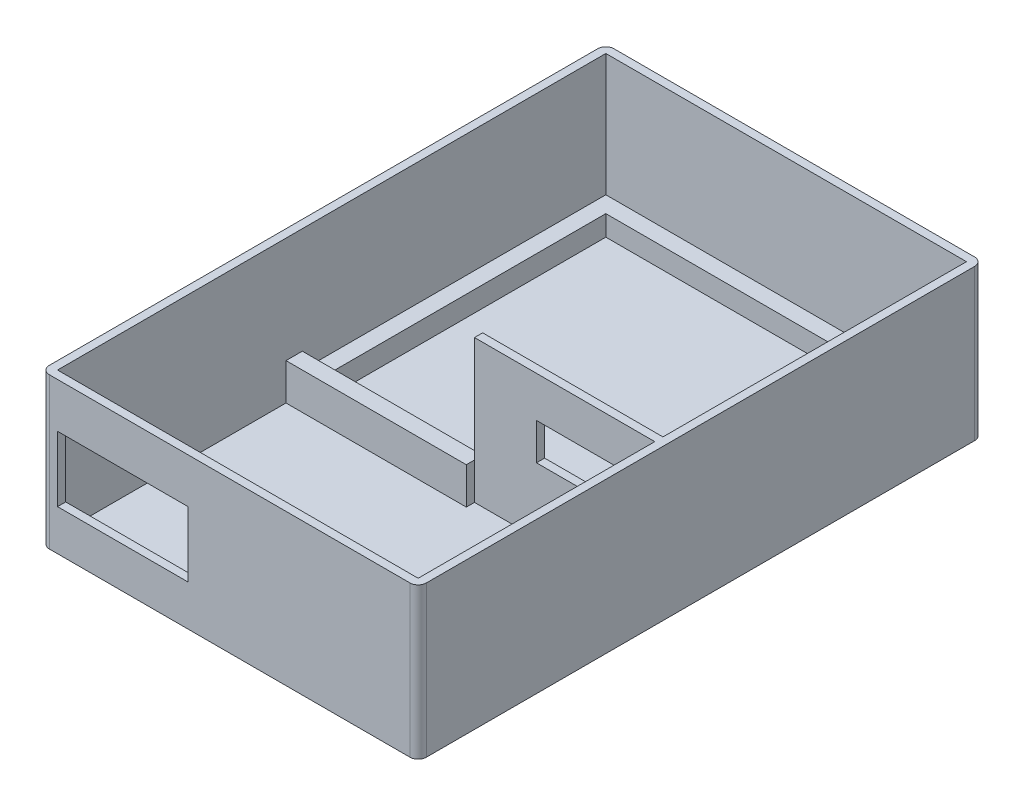
ISO-10303-21;
HEADER;
FILE_DESCRIPTION(('STEP AP214'),'2;1');
FILE_NAME('part.step','',(''),(''),'','','');
FILE_SCHEMA(('AUTOMOTIVE_DESIGN { 1 0 10303 214 1 1 1 1 }'));
ENDSEC;
DATA;
#1=APPLICATION_CONTEXT('core data for automotive mechanical design processes');
#2=APPLICATION_PROTOCOL_DEFINITION('international standard','automotive_design',2000,#1);
#3=PRODUCT_CONTEXT('',#1,'mechanical');
#4=PRODUCT('Part','Part','',(#3));
#5=PRODUCT_RELATED_PRODUCT_CATEGORY('part','',(#4));
#6=PRODUCT_DEFINITION_FORMATION('','',#4);
#7=PRODUCT_DEFINITION_CONTEXT('part definition',#1,'design');
#8=PRODUCT_DEFINITION('design','',#6,#7);
#9=PRODUCT_DEFINITION_SHAPE('','',#8);
#10=(LENGTH_UNIT() NAMED_UNIT(*) SI_UNIT(.MILLI.,.METRE.));
#11=(NAMED_UNIT(*) PLANE_ANGLE_UNIT() SI_UNIT($,.RADIAN.));
#12=(NAMED_UNIT(*) SI_UNIT($,.STERADIAN.) SOLID_ANGLE_UNIT());
#13=UNCERTAINTY_MEASURE_WITH_UNIT(LENGTH_MEASURE(1.E-05),#10,'distance_accuracy_value','');
#14=(GEOMETRIC_REPRESENTATION_CONTEXT(3) GLOBAL_UNCERTAINTY_ASSIGNED_CONTEXT((#13)) GLOBAL_UNIT_ASSIGNED_CONTEXT((#10,
#11,#12)) REPRESENTATION_CONTEXT('',''));
#15=CARTESIAN_POINT('',(0.,0.,0.));
#16=DIRECTION('',(0.,0.,1.));
#17=DIRECTION('',(1.,0.,0.));
#18=AXIS2_PLACEMENT_3D('',#15,#16,#17);
#19=CARTESIAN_POINT('',(0.,2.5,0.));
#20=DIRECTION('',(0.,1.,0.));
#21=DIRECTION('',(0.,0.,1.));
#22=AXIS2_PLACEMENT_3D('',#19,#20,#21);
#23=PLANE('',#22);
#24=DIRECTION('',(1.,0.,0.));
#25=VECTOR('',#24,1.);
#26=CARTESIAN_POINT('',(22.1,2.5,18.6));
#27=LINE('',#26,#25);
#28=CARTESIAN_POINT('',(-22.1,2.5,18.6));
#29=VERTEX_POINT('',#28);
#30=CARTESIAN_POINT('',(22.1,2.5,18.6));
#31=VERTEX_POINT('',#30);
#32=EDGE_CURVE('E352',#29,#31,#27,.T.);
#33=ORIENTED_EDGE('',*,*,#32,.T.);
#34=DIRECTION('',(0.,0.,-1.));
#35=VECTOR('',#34,1.);
#36=CARTESIAN_POINT('',(22.1,2.5,18.6));
#37=LINE('',#36,#35);
#38=CARTESIAN_POINT('',(22.1,2.5,-18.6));
#39=VERTEX_POINT('',#38);
#40=EDGE_CURVE('E371',#31,#39,#37,.T.);
#41=ORIENTED_EDGE('',*,*,#40,.T.);
#42=DIRECTION('',(-1.,0.,0.));
#43=VECTOR('',#42,1.);
#44=CARTESIAN_POINT('',(22.1,2.5,-18.6));
#45=LINE('',#44,#43);
#46=CARTESIAN_POINT('',(-22.1,2.5,-18.6));
#47=VERTEX_POINT('',#46);
#48=EDGE_CURVE('E373',#39,#47,#45,.T.);
#49=ORIENTED_EDGE('',*,*,#48,.T.);
#50=DIRECTION('',(0.,0.,1.));
#51=VECTOR('',#50,1.);
#52=CARTESIAN_POINT('',(-22.1,2.5,18.6));
#53=LINE('',#52,#51);
#54=EDGE_CURVE('E362',#47,#29,#53,.T.);
#55=ORIENTED_EDGE('',*,*,#54,.T.);
#56=EDGE_LOOP('',(#33,#41,#49,#55));
#57=FACE_BOUND('',#56,.T.);
#58=DIRECTION('',(-1.,0.,0.));
#59=VECTOR('',#58,1.);
#60=CARTESIAN_POINT('',(-20.1,2.5,-16.6));
#61=LINE('',#60,#59);
#62=CARTESIAN_POINT('',(20.1,2.5,-16.6));
#63=VERTEX_POINT('',#62);
#64=CARTESIAN_POINT('',(-20.1,2.5,-16.6));
#65=VERTEX_POINT('',#64);
#66=EDGE_CURVE('E407',#63,#65,#61,.T.);
#67=ORIENTED_EDGE('',*,*,#66,.F.);
#68=DIRECTION('',(0.,0.,-1.));
#69=VECTOR('',#68,1.);
#70=CARTESIAN_POINT('',(20.1,2.5,16.6));
#71=LINE('',#70,#69);
#72=CARTESIAN_POINT('',(20.1,2.5,16.6));
#73=VERTEX_POINT('',#72);
#74=EDGE_CURVE('E405',#73,#63,#71,.T.);
#75=ORIENTED_EDGE('',*,*,#74,.F.);
#76=DIRECTION('',(1.,0.,0.));
#77=VECTOR('',#76,1.);
#78=CARTESIAN_POINT('',(-20.1,2.5,16.6));
#79=LINE('',#78,#77);
#80=CARTESIAN_POINT('',(-20.1,2.5,16.6));
#81=VERTEX_POINT('',#80);
#82=EDGE_CURVE('E413',#81,#73,#79,.T.);
#83=ORIENTED_EDGE('',*,*,#82,.F.);
#84=DIRECTION('',(0.,0.,1.));
#85=VECTOR('',#84,1.);
#86=CARTESIAN_POINT('',(-20.1,2.5,16.6));
#87=LINE('',#86,#85);
#88=EDGE_CURVE('E410',#65,#81,#87,.T.);
#89=ORIENTED_EDGE('',*,*,#88,.F.);
#90=EDGE_LOOP('',(#67,#75,#83,#89));
#91=FACE_BOUND('',#90,.T.);
#92=ADVANCED_FACE('F36',(#57,#91),#23,.T.);
#93=CARTESIAN_POINT('',(20.1,2.5,16.6));
#94=DIRECTION('',(-1.,0.,0.));
#95=DIRECTION('',(0.,0.,1.));
#96=AXIS2_PLACEMENT_3D('',#93,#94,#95);
#97=PLANE('',#96);
#98=DIRECTION('',(0.,0.,-1.));
#99=VECTOR('',#98,1.);
#100=CARTESIAN_POINT('',(20.1,0.,16.6));
#101=LINE('',#100,#99);
#102=CARTESIAN_POINT('',(20.1,0.,16.6));
#103=VERTEX_POINT('',#102);
#104=CARTESIAN_POINT('',(20.1,0.,-16.6));
#105=VERTEX_POINT('',#104);
#106=EDGE_CURVE('E404',#103,#105,#101,.T.);
#107=ORIENTED_EDGE('',*,*,#106,.F.);
#108=DIRECTION('',(0.,-1.,0.));
#109=VECTOR('',#108,1.);
#110=CARTESIAN_POINT('',(20.1,2.5,16.6));
#111=LINE('',#110,#109);
#112=EDGE_CURVE('E415',#73,#103,#111,.T.);
#113=ORIENTED_EDGE('',*,*,#112,.F.);
#114=ORIENTED_EDGE('',*,*,#74,.T.);
#115=DIRECTION('',(0.,-1.,0.));
#116=VECTOR('',#115,1.);
#117=CARTESIAN_POINT('',(20.1,2.5,-16.6));
#118=LINE('',#117,#116);
#119=EDGE_CURVE('E431',#63,#105,#118,.T.);
#120=ORIENTED_EDGE('',*,*,#119,.T.);
#121=EDGE_LOOP('',(#107,#113,#114,#120));
#122=FACE_BOUND('',#121,.T.);
#123=ADVANCED_FACE('F514',(#122),#97,.T.);
#124=CARTESIAN_POINT('',(-20.1,2.5,-16.6));
#125=DIRECTION('',(0.,0.,1.));
#126=DIRECTION('',(1.,0.,0.));
#127=AXIS2_PLACEMENT_3D('',#124,#125,#126);
#128=PLANE('',#127);
#129=DIRECTION('',(-1.,0.,0.));
#130=VECTOR('',#129,1.);
#131=CARTESIAN_POINT('',(-20.1,0.,-16.6));
#132=LINE('',#131,#130);
#133=CARTESIAN_POINT('',(-20.1,0.,-16.6));
#134=VERTEX_POINT('',#133);
#135=EDGE_CURVE('E418',#105,#134,#132,.T.);
#136=ORIENTED_EDGE('',*,*,#135,.F.);
#137=ORIENTED_EDGE('',*,*,#119,.F.);
#138=ORIENTED_EDGE('',*,*,#66,.T.);
#139=DIRECTION('',(0.,-1.,0.));
#140=VECTOR('',#139,1.);
#141=CARTESIAN_POINT('',(-20.1,2.5,-16.6));
#142=LINE('',#141,#140);
#143=EDGE_CURVE('E429',#65,#134,#142,.T.);
#144=ORIENTED_EDGE('',*,*,#143,.T.);
#145=EDGE_LOOP('',(#136,#137,#138,#144));
#146=FACE_BOUND('',#145,.T.);
#147=ADVANCED_FACE('F520',(#146),#128,.T.);
#148=CARTESIAN_POINT('',(-20.1,2.5,16.6));
#149=DIRECTION('',(1.,0.,0.));
#150=DIRECTION('',(0.,0.,-1.));
#151=AXIS2_PLACEMENT_3D('',#148,#149,#150);
#152=PLANE('',#151);
#153=DIRECTION('',(0.,0.,1.));
#154=VECTOR('',#153,1.);
#155=CARTESIAN_POINT('',(-20.1,0.,16.6));
#156=LINE('',#155,#154);
#157=CARTESIAN_POINT('',(-20.1,0.,16.6));
#158=VERTEX_POINT('',#157);
#159=EDGE_CURVE('E421',#134,#158,#156,.T.);
#160=ORIENTED_EDGE('',*,*,#159,.F.);
#161=ORIENTED_EDGE('',*,*,#143,.F.);
#162=ORIENTED_EDGE('',*,*,#88,.T.);
#163=DIRECTION('',(0.,-1.,0.));
#164=VECTOR('',#163,1.);
#165=CARTESIAN_POINT('',(-20.1,2.5,16.6));
#166=LINE('',#165,#164);
#167=EDGE_CURVE('E427',#81,#158,#166,.T.);
#168=ORIENTED_EDGE('',*,*,#167,.T.);
#169=EDGE_LOOP('',(#160,#161,#162,#168));
#170=FACE_BOUND('',#169,.T.);
#171=ADVANCED_FACE('F774',(#170),#152,.T.);
#172=CARTESIAN_POINT('',(-20.1,2.5,16.6));
#173=DIRECTION('',(0.,0.,-1.));
#174=DIRECTION('',(-1.,0.,0.));
#175=AXIS2_PLACEMENT_3D('',#172,#173,#174);
#176=PLANE('',#175);
#177=DIRECTION('',(1.,0.,0.));
#178=VECTOR('',#177,1.);
#179=CARTESIAN_POINT('',(-20.1,0.,16.6));
#180=LINE('',#179,#178);
#181=EDGE_CURVE('E408',#158,#103,#180,.T.);
#182=ORIENTED_EDGE('',*,*,#181,.F.);
#183=ORIENTED_EDGE('',*,*,#167,.F.);
#184=ORIENTED_EDGE('',*,*,#82,.T.);
#185=ORIENTED_EDGE('',*,*,#112,.T.);
#186=EDGE_LOOP('',(#182,#183,#184,#185));
#187=FACE_BOUND('',#186,.T.);
#188=ADVANCED_FACE('F770',(#187),#176,.T.);
#189=CARTESIAN_POINT('',(0.,0.,0.));
#190=DIRECTION('',(0.,-1.,0.));
#191=DIRECTION('',(0.,0.,-1.));
#192=AXIS2_PLACEMENT_3D('',#189,#190,#191);
#193=PLANE('',#192);
#194=ORIENTED_EDGE('',*,*,#106,.T.);
#195=ORIENTED_EDGE('',*,*,#135,.T.);
#196=ORIENTED_EDGE('',*,*,#159,.T.);
#197=ORIENTED_EDGE('',*,*,#181,.T.);
#198=EDGE_LOOP('',(#194,#195,#196,#197));
#199=FACE_BOUND('',#198,.T.);
#200=ADVANCED_FACE('F765',(#199),#193,.F.);
#201=CARTESIAN_POINT('',(0.,17.5,0.));
#202=DIRECTION('',(0.,1.,0.));
#203=DIRECTION('',(0.,0.,1.));
#204=AXIS2_PLACEMENT_3D('',#201,#202,#203);
#205=PLANE('',#204);
#206=DIRECTION('',(-1.,0.,0.));
#207=VECTOR('',#206,1.);
#208=CARTESIAN_POINT('',(0.,17.5,19.6));
#209=LINE('',#208,#207);
#210=CARTESIAN_POINT('',(22.1,17.5,19.6));
#211=VERTEX_POINT('',#210);
#212=CARTESIAN_POINT('',(0.,17.5,19.6));
#213=VERTEX_POINT('',#212);
#214=EDGE_CURVE('E276',#211,#213,#209,.T.);
#215=ORIENTED_EDGE('',*,*,#214,.F.);
#216=DIRECTION('',(0.,0.,-1.));
#217=VECTOR('',#216,1.);
#218=CARTESIAN_POINT('',(22.1,17.5,48.6));
#219=LINE('',#218,#217);
#220=CARTESIAN_POINT('',(22.1,17.5,48.6));
#221=VERTEX_POINT('',#220);
#222=EDGE_CURVE('E333',#221,#211,#219,.T.);
#223=ORIENTED_EDGE('',*,*,#222,.F.);
#224=DIRECTION('',(1.,0.,0.));
#225=VECTOR('',#224,1.);
#226=CARTESIAN_POINT('',(-22.1,17.5,48.6));
#227=LINE('',#226,#225);
#228=CARTESIAN_POINT('',(-22.1,17.5,48.6));
#229=VERTEX_POINT('',#228);
#230=EDGE_CURVE('E311',#229,#221,#227,.T.);
#231=ORIENTED_EDGE('',*,*,#230,.F.);
#232=DIRECTION('',(0.,0.,1.));
#233=VECTOR('',#232,1.);
#234=CARTESIAN_POINT('',(-22.1,17.5,18.6));
#235=LINE('',#234,#233);
#236=CARTESIAN_POINT('',(-22.1,17.5,-18.6));
#237=VERTEX_POINT('',#236);
#238=EDGE_CURVE('E367',#237,#229,#235,.T.);
#239=ORIENTED_EDGE('',*,*,#238,.F.);
#240=DIRECTION('',(-1.,0.,0.));
#241=VECTOR('',#240,1.);
#242=CARTESIAN_POINT('',(22.1,17.5,-18.6));
#243=LINE('',#242,#241);
#244=CARTESIAN_POINT('',(22.1,17.5,-18.6));
#245=VERTEX_POINT('',#244);
#246=EDGE_CURVE('E364',#245,#237,#243,.T.);
#247=ORIENTED_EDGE('',*,*,#246,.F.);
#248=DIRECTION('',(0.,0.,-1.));
#249=VECTOR('',#248,1.);
#250=CARTESIAN_POINT('',(22.1,17.5,18.6));
#251=LINE('',#250,#249);
#252=CARTESIAN_POINT('',(22.1,17.5,18.6));
#253=VERTEX_POINT('',#252);
#254=EDGE_CURVE('E361',#253,#245,#251,.T.);
#255=ORIENTED_EDGE('',*,*,#254,.F.);
#256=DIRECTION('',(1.,0.,0.));
#257=VECTOR('',#256,1.);
#258=CARTESIAN_POINT('',(22.1,17.5,18.6));
#259=LINE('',#258,#257);
#260=CARTESIAN_POINT('',(0.,17.5,18.6));
#261=VERTEX_POINT('',#260);
#262=EDGE_CURVE('E359',#261,#253,#259,.T.);
#263=ORIENTED_EDGE('',*,*,#262,.F.);
#264=DIRECTION('',(0.,0.,-1.));
#265=VECTOR('',#264,1.);
#266=CARTESIAN_POINT('',(0.,17.5,18.6));
#267=LINE('',#266,#265);
#268=EDGE_CURVE('E285',#213,#261,#267,.T.);
#269=ORIENTED_EDGE('',*,*,#268,.F.);
#270=EDGE_LOOP('',(#215,#223,#231,#239,#247,#255,#263,#269));
#271=FACE_BOUND('',#270,.T.);
#272=DIRECTION('',(-1.,0.,0.));
#273=VECTOR('',#272,1.);
#274=CARTESIAN_POINT('',(23.1,17.5,-19.6));
#275=LINE('',#274,#273);
#276=CARTESIAN_POINT('',(22.1,17.5,-19.6));
#277=VERTEX_POINT('',#276);
#278=CARTESIAN_POINT('',(-22.1,17.5,-19.6));
#279=VERTEX_POINT('',#278);
#280=EDGE_CURVE('E392',#277,#279,#275,.T.);
#281=ORIENTED_EDGE('',*,*,#280,.T.);
#282=CARTESIAN_POINT('',(-22.1,17.5,-18.6));
#283=DIRECTION('',(0.,1.,0.));
#284=DIRECTION('',(0.,0.,1.));
#285=AXIS2_PLACEMENT_3D('',#282,#283,#284);
#286=CIRCLE('',#285,1.);
#287=CARTESIAN_POINT('',(-23.1,17.5,-18.6));
#288=VERTEX_POINT('',#287);
#289=EDGE_CURVE('E472',#279,#288,#286,.T.);
#290=ORIENTED_EDGE('',*,*,#289,.T.);
#291=DIRECTION('',(0.,0.,1.));
#292=VECTOR('',#291,1.);
#293=CARTESIAN_POINT('',(-23.1,17.5,19.6));
#294=LINE('',#293,#292);
#295=CARTESIAN_POINT('',(-23.1,17.5,48.6));
#296=VERTEX_POINT('',#295);
#297=EDGE_CURVE('E387',#288,#296,#294,.T.);
#298=ORIENTED_EDGE('',*,*,#297,.T.);
#299=CARTESIAN_POINT('',(-22.1,17.5,48.6));
#300=DIRECTION('',(0.,1.,0.));
#301=DIRECTION('',(0.,0.,1.));
#302=AXIS2_PLACEMENT_3D('',#299,#300,#301);
#303=CIRCLE('',#302,1.);
#304=CARTESIAN_POINT('',(-22.1,17.5,49.6));
#305=VERTEX_POINT('',#304);
#306=EDGE_CURVE('E467',#296,#305,#303,.T.);
#307=ORIENTED_EDGE('',*,*,#306,.T.);
#308=DIRECTION('',(1.,0.,0.));
#309=VECTOR('',#308,1.);
#310=CARTESIAN_POINT('',(-23.1,17.5,49.6));
#311=LINE('',#310,#309);
#312=CARTESIAN_POINT('',(22.1,17.5,49.6));
#313=VERTEX_POINT('',#312);
#314=EDGE_CURVE('E314',#305,#313,#311,.T.);
#315=ORIENTED_EDGE('',*,*,#314,.T.);
#316=CARTESIAN_POINT('',(22.1,17.5,48.6));
#317=DIRECTION('',(0.,1.,0.));
#318=DIRECTION('',(0.,0.,1.));
#319=AXIS2_PLACEMENT_3D('',#316,#317,#318);
#320=CIRCLE('',#319,1.);
#321=CARTESIAN_POINT('',(23.1,17.5,48.6));
#322=VERTEX_POINT('',#321);
#323=EDGE_CURVE('E58',#313,#322,#320,.T.);
#324=ORIENTED_EDGE('',*,*,#323,.T.);
#325=DIRECTION('',(0.,0.,-1.));
#326=VECTOR('',#325,1.);
#327=CARTESIAN_POINT('',(23.1,17.5,19.6));
#328=LINE('',#327,#326);
#329=CARTESIAN_POINT('',(23.1,17.5,-18.6));
#330=VERTEX_POINT('',#329);
#331=EDGE_CURVE('E390',#322,#330,#328,.T.);
#332=ORIENTED_EDGE('',*,*,#331,.T.);
#333=CARTESIAN_POINT('',(22.1,17.5,-18.6));
#334=DIRECTION('',(0.,1.,0.));
#335=DIRECTION('',(0.,0.,1.));
#336=AXIS2_PLACEMENT_3D('',#333,#334,#335);
#337=CIRCLE('',#336,1.);
#338=EDGE_CURVE('E470',#330,#277,#337,.T.);
#339=ORIENTED_EDGE('',*,*,#338,.T.);
#340=EDGE_LOOP('',(#281,#290,#298,#307,#315,#324,#332,#339));
#341=FACE_BOUND('',#340,.T.);
#342=ADVANCED_FACE('F492',(#271,#341),#205,.T.);
#343=CARTESIAN_POINT('',(22.1,17.5,18.6));
#344=DIRECTION('',(0.,0.,-1.));
#345=DIRECTION('',(-1.,0.,0.));
#346=AXIS2_PLACEMENT_3D('',#343,#344,#345);
#347=PLANE('',#346);
#348=DIRECTION('',(0.,1.,0.));
#349=VECTOR('',#348,1.);
#350=CARTESIAN_POINT('',(0.,-19.6903132019357,18.6));
#351=LINE('',#350,#349);
#352=CARTESIAN_POINT('',(0.,4.5,18.6));
#353=VERTEX_POINT('',#352);
#354=EDGE_CURVE('E306',#353,#261,#351,.T.);
#355=ORIENTED_EDGE('',*,*,#354,.T.);
#356=ORIENTED_EDGE('',*,*,#262,.T.);
#357=DIRECTION('',(0.,-1.,0.));
#358=VECTOR('',#357,1.);
#359=CARTESIAN_POINT('',(22.1,17.5,18.6));
#360=LINE('',#359,#358);
#361=EDGE_CURVE('E384',#253,#31,#360,.T.);
#362=ORIENTED_EDGE('',*,*,#361,.T.);
#363=ORIENTED_EDGE('',*,*,#32,.F.);
#364=DIRECTION('',(0.,-1.,0.));
#365=VECTOR('',#364,1.);
#366=CARTESIAN_POINT('',(-22.1,17.5,18.6));
#367=LINE('',#366,#365);
#368=CARTESIAN_POINT('',(-22.1,4.5,18.6));
#369=VERTEX_POINT('',#368);
#370=EDGE_CURVE('E369',#369,#29,#367,.T.);
#371=ORIENTED_EDGE('',*,*,#370,.F.);
#372=DIRECTION('',(1.,0.,0.));
#373=VECTOR('',#372,1.);
#374=CARTESIAN_POINT('',(-22.1,4.5,18.6));
#375=LINE('',#374,#373);
#376=EDGE_CURVE('E298',#369,#353,#375,.T.);
#377=ORIENTED_EDGE('',*,*,#376,.T.);
#378=EDGE_LOOP('',(#355,#356,#362,#363,#371,#377));
#379=FACE_BOUND('',#378,.T.);
#380=DIRECTION('',(0.,-1.,0.));
#381=VECTOR('',#380,1.);
#382=CARTESIAN_POINT('',(17.1,8.,18.6));
#383=LINE('',#382,#381);
#384=CARTESIAN_POINT('',(17.1,12.5,18.6));
#385=VERTEX_POINT('',#384);
#386=CARTESIAN_POINT('',(17.1,8.,18.6));
#387=VERTEX_POINT('',#386);
#388=EDGE_CURVE('E338',#385,#387,#383,.T.);
#389=ORIENTED_EDGE('',*,*,#388,.F.);
#390=DIRECTION('',(1.,0.,0.));
#391=VECTOR('',#390,1.);
#392=CARTESIAN_POINT('',(7.6,12.5,18.6));
#393=LINE('',#392,#391);
#394=CARTESIAN_POINT('',(7.6,12.5,18.6));
#395=VERTEX_POINT('',#394);
#396=EDGE_CURVE('E346',#395,#385,#393,.T.);
#397=ORIENTED_EDGE('',*,*,#396,.F.);
#398=DIRECTION('',(0.,1.,0.));
#399=VECTOR('',#398,1.);
#400=CARTESIAN_POINT('',(7.6,8.,18.6));
#401=LINE('',#400,#399);
#402=CARTESIAN_POINT('',(7.6,8.,18.6));
#403=VERTEX_POINT('',#402);
#404=EDGE_CURVE('E343',#403,#395,#401,.T.);
#405=ORIENTED_EDGE('',*,*,#404,.F.);
#406=DIRECTION('',(-1.,0.,0.));
#407=VECTOR('',#406,1.);
#408=CARTESIAN_POINT('',(7.6,8.,18.6));
#409=LINE('',#408,#407);
#410=EDGE_CURVE('E340',#387,#403,#409,.T.);
#411=ORIENTED_EDGE('',*,*,#410,.F.);
#412=EDGE_LOOP('',(#389,#397,#405,#411));
#413=FACE_BOUND('',#412,.T.);
#414=ADVANCED_FACE('F677',(#379,#413),#347,.T.);
#415=CARTESIAN_POINT('',(22.1,17.5,18.6));
#416=DIRECTION('',(-1.,0.,0.));
#417=DIRECTION('',(0.,0.,1.));
#418=AXIS2_PLACEMENT_3D('',#415,#416,#417);
#419=PLANE('',#418);
#420=ORIENTED_EDGE('',*,*,#40,.F.);
#421=ORIENTED_EDGE('',*,*,#361,.F.);
#422=ORIENTED_EDGE('',*,*,#254,.T.);
#423=DIRECTION('',(0.,-1.,0.));
#424=VECTOR('',#423,1.);
#425=CARTESIAN_POINT('',(22.1,17.5,-18.6));
#426=LINE('',#425,#424);
#427=EDGE_CURVE('E381',#245,#39,#426,.T.);
#428=ORIENTED_EDGE('',*,*,#427,.T.);
#429=EDGE_LOOP('',(#420,#421,#422,#428));
#430=FACE_BOUND('',#429,.T.);
#431=ADVANCED_FACE('F756',(#430),#419,.T.);
#432=CARTESIAN_POINT('',(22.1,17.5,-18.6));
#433=DIRECTION('',(0.,0.,1.));
#434=DIRECTION('',(1.,0.,0.));
#435=AXIS2_PLACEMENT_3D('',#432,#433,#434);
#436=PLANE('',#435);
#437=ORIENTED_EDGE('',*,*,#48,.F.);
#438=ORIENTED_EDGE('',*,*,#427,.F.);
#439=ORIENTED_EDGE('',*,*,#246,.T.);
#440=DIRECTION('',(0.,-1.,0.));
#441=VECTOR('',#440,1.);
#442=CARTESIAN_POINT('',(-22.1,17.5,-18.6));
#443=LINE('',#442,#441);
#444=EDGE_CURVE('E378',#237,#47,#443,.T.);
#445=ORIENTED_EDGE('',*,*,#444,.T.);
#446=EDGE_LOOP('',(#437,#438,#439,#445));
#447=FACE_BOUND('',#446,.T.);
#448=ADVANCED_FACE('F665',(#447),#436,.T.);
#449=CARTESIAN_POINT('',(-22.1,17.5,18.6));
#450=DIRECTION('',(1.,0.,0.));
#451=DIRECTION('',(0.,0.,-1.));
#452=AXIS2_PLACEMENT_3D('',#449,#450,#451);
#453=PLANE('',#452);
#454=ORIENTED_EDGE('',*,*,#54,.F.);
#455=ORIENTED_EDGE('',*,*,#444,.F.);
#456=ORIENTED_EDGE('',*,*,#238,.T.);
#457=DIRECTION('',(0.,-1.,0.));
#458=VECTOR('',#457,1.);
#459=CARTESIAN_POINT('',(-22.1,72.5857513337161,48.6));
#460=LINE('',#459,#458);
#461=CARTESIAN_POINT('',(-22.1,0.,48.6));
#462=VERTEX_POINT('',#461);
#463=EDGE_CURVE('E327',#229,#462,#460,.T.);
#464=ORIENTED_EDGE('',*,*,#463,.T.);
#465=DIRECTION('',(0.,0.,1.));
#466=VECTOR('',#465,1.);
#467=CARTESIAN_POINT('',(-22.1,0.,20.6));
#468=LINE('',#467,#466);
#469=CARTESIAN_POINT('',(-22.1,0.,20.6));
#470=VERTEX_POINT('',#469);
#471=EDGE_CURVE('E318',#470,#462,#468,.T.);
#472=ORIENTED_EDGE('',*,*,#471,.F.);
#473=DIRECTION('',(0.,-1.,0.));
#474=VECTOR('',#473,1.);
#475=CARTESIAN_POINT('',(-22.1,72.5857513337161,20.6));
#476=LINE('',#475,#474);
#477=CARTESIAN_POINT('',(-22.1,4.5,20.6));
#478=VERTEX_POINT('',#477);
#479=EDGE_CURVE('E330',#478,#470,#476,.T.);
#480=ORIENTED_EDGE('',*,*,#479,.F.);
#481=DIRECTION('',(0.,0.,-1.));
#482=VECTOR('',#481,1.);
#483=CARTESIAN_POINT('',(-22.1,4.5,18.6));
#484=LINE('',#483,#482);
#485=EDGE_CURVE('E302',#478,#369,#484,.T.);
#486=ORIENTED_EDGE('',*,*,#485,.T.);
#487=ORIENTED_EDGE('',*,*,#370,.T.);
#488=EDGE_LOOP('',(#454,#455,#456,#464,#472,#480,#486,#487));
#489=FACE_BOUND('',#488,.T.);
#490=ADVANCED_FACE('F660',(#489),#453,.T.);
#491=CARTESIAN_POINT('',(0.,-1.,0.));
#492=DIRECTION('',(0.,-1.,0.));
#493=DIRECTION('',(0.,0.,-1.));
#494=AXIS2_PLACEMENT_3D('',#491,#492,#493);
#495=PLANE('',#494);
#496=DIRECTION('',(0.,0.,-1.));
#497=VECTOR('',#496,1.);
#498=CARTESIAN_POINT('',(-23.1,-1.,-19.6));
#499=LINE('',#498,#497);
#500=CARTESIAN_POINT('',(-23.1,-1.,48.6));
#501=VERTEX_POINT('',#500);
#502=CARTESIAN_POINT('',(-23.1,-1.,-18.6));
#503=VERTEX_POINT('',#502);
#504=EDGE_CURVE('E395',#501,#503,#499,.T.);
#505=ORIENTED_EDGE('',*,*,#504,.T.);
#506=CARTESIAN_POINT('',(-22.1,-1.,-18.6));
#507=DIRECTION('',(0.,-1.,0.));
#508=DIRECTION('',(0.,0.,-1.));
#509=AXIS2_PLACEMENT_3D('',#506,#507,#508);
#510=CIRCLE('',#509,1.);
#511=CARTESIAN_POINT('',(-22.1,-1.,-19.6));
#512=VERTEX_POINT('',#511);
#513=EDGE_CURVE('E460',#503,#512,#510,.T.);
#514=ORIENTED_EDGE('',*,*,#513,.T.);
#515=DIRECTION('',(1.,0.,0.));
#516=VECTOR('',#515,1.);
#517=CARTESIAN_POINT('',(23.1,-1.,-19.6));
#518=LINE('',#517,#516);
#519=CARTESIAN_POINT('',(22.1,-1.,-19.6));
#520=VERTEX_POINT('',#519);
#521=EDGE_CURVE('E398',#512,#520,#518,.T.);
#522=ORIENTED_EDGE('',*,*,#521,.T.);
#523=CARTESIAN_POINT('',(22.1,-1.,-18.6));
#524=DIRECTION('',(0.,-1.,0.));
#525=DIRECTION('',(0.,0.,-1.));
#526=AXIS2_PLACEMENT_3D('',#523,#524,#525);
#527=CIRCLE('',#526,1.);
#528=CARTESIAN_POINT('',(23.1,-1.,-18.6));
#529=VERTEX_POINT('',#528);
#530=EDGE_CURVE('E458',#520,#529,#527,.T.);
#531=ORIENTED_EDGE('',*,*,#530,.T.);
#532=DIRECTION('',(0.,0.,1.));
#533=VECTOR('',#532,1.);
#534=CARTESIAN_POINT('',(23.1,-1.,-19.6));
#535=LINE('',#534,#533);
#536=CARTESIAN_POINT('',(23.1,-1.,48.6));
#537=VERTEX_POINT('',#536);
#538=EDGE_CURVE('E401',#529,#537,#535,.T.);
#539=ORIENTED_EDGE('',*,*,#538,.T.);
#540=CARTESIAN_POINT('',(22.1,-1.,48.6));
#541=DIRECTION('',(0.,-1.,0.));
#542=DIRECTION('',(0.,0.,-1.));
#543=AXIS2_PLACEMENT_3D('',#540,#541,#542);
#544=CIRCLE('',#543,1.);
#545=CARTESIAN_POINT('',(22.1,-1.,49.6));
#546=VERTEX_POINT('',#545);
#547=EDGE_CURVE('E456',#537,#546,#544,.T.);
#548=ORIENTED_EDGE('',*,*,#547,.T.);
#549=DIRECTION('',(-1.,0.,0.));
#550=VECTOR('',#549,1.);
#551=CARTESIAN_POINT('',(-23.1,-1.,49.6));
#552=LINE('',#551,#550);
#553=CARTESIAN_POINT('',(-22.1,-1.,49.6));
#554=VERTEX_POINT('',#553);
#555=EDGE_CURVE('E335',#546,#554,#552,.T.);
#556=ORIENTED_EDGE('',*,*,#555,.T.);
#557=CARTESIAN_POINT('',(-22.1,-1.,48.6));
#558=DIRECTION('',(0.,-1.,0.));
#559=DIRECTION('',(0.,0.,-1.));
#560=AXIS2_PLACEMENT_3D('',#557,#558,#559);
#561=CIRCLE('',#560,1.);
#562=EDGE_CURVE('E454',#554,#501,#561,.T.);
#563=ORIENTED_EDGE('',*,*,#562,.T.);
#564=EDGE_LOOP('',(#505,#514,#522,#531,#539,#548,#556,#563));
#565=FACE_BOUND('',#564,.T.);
#566=ADVANCED_FACE('F485',(#565),#495,.T.);
#567=CARTESIAN_POINT('',(-23.1,2.5,19.6));
#568=DIRECTION('',(1.,0.,0.));
#569=DIRECTION('',(0.,0.,-1.));
#570=AXIS2_PLACEMENT_3D('',#567,#568,#569);
#571=PLANE('',#570);
#572=ORIENTED_EDGE('',*,*,#297,.F.);
#573=DIRECTION('',(0.,-1.,0.));
#574=VECTOR('',#573,1.);
#575=CARTESIAN_POINT('',(-23.1,2.5,-18.6));
#576=LINE('',#575,#574);
#577=EDGE_CURVE('E451',#288,#503,#576,.T.);
#578=ORIENTED_EDGE('',*,*,#577,.T.);
#579=ORIENTED_EDGE('',*,*,#504,.F.);
#580=DIRECTION('',(0.,-1.,0.));
#581=VECTOR('',#580,1.);
#582=CARTESIAN_POINT('',(-23.1,17.5,48.6));
#583=LINE('',#582,#581);
#584=EDGE_CURVE('E449',#501,#296,#583,.F.);
#585=ORIENTED_EDGE('',*,*,#584,.T.);
#586=EDGE_LOOP('',(#572,#578,#579,#585));
#587=FACE_BOUND('',#586,.T.);
#588=ADVANCED_FACE('F507',(#587),#571,.F.);
#589=CARTESIAN_POINT('',(-23.1,2.5,-19.6));
#590=DIRECTION('',(0.,0.,1.));
#591=DIRECTION('',(1.,0.,0.));
#592=AXIS2_PLACEMENT_3D('',#589,#590,#591);
#593=PLANE('',#592);
#594=ORIENTED_EDGE('',*,*,#521,.F.);
#595=DIRECTION('',(0.,-1.,0.));
#596=VECTOR('',#595,1.);
#597=CARTESIAN_POINT('',(-22.1,2.5,-19.6));
#598=LINE('',#597,#596);
#599=EDGE_CURVE('E465',#512,#279,#598,.F.);
#600=ORIENTED_EDGE('',*,*,#599,.T.);
#601=ORIENTED_EDGE('',*,*,#280,.F.);
#602=DIRECTION('',(0.,-1.,0.));
#603=VECTOR('',#602,1.);
#604=CARTESIAN_POINT('',(22.1,2.5,-19.6));
#605=LINE('',#604,#603);
#606=EDGE_CURVE('E462',#277,#520,#605,.T.);
#607=ORIENTED_EDGE('',*,*,#606,.T.);
#608=EDGE_LOOP('',(#594,#600,#601,#607));
#609=FACE_BOUND('',#608,.T.);
#610=ADVANCED_FACE('F499',(#609),#593,.F.);
#611=CARTESIAN_POINT('',(23.1,2.5,19.6));
#612=DIRECTION('',(-1.,0.,0.));
#613=DIRECTION('',(0.,0.,1.));
#614=AXIS2_PLACEMENT_3D('',#611,#612,#613);
#615=PLANE('',#614);
#616=ORIENTED_EDGE('',*,*,#538,.F.);
#617=DIRECTION('',(0.,-1.,0.));
#618=VECTOR('',#617,1.);
#619=CARTESIAN_POINT('',(23.1,2.5,-18.6));
#620=LINE('',#619,#618);
#621=EDGE_CURVE('E51',#529,#330,#620,.F.);
#622=ORIENTED_EDGE('',*,*,#621,.T.);
#623=ORIENTED_EDGE('',*,*,#331,.F.);
#624=DIRECTION('',(0.,-1.,0.));
#625=VECTOR('',#624,1.);
#626=CARTESIAN_POINT('',(23.1,-1.,48.6));
#627=LINE('',#626,#625);
#628=EDGE_CURVE('E474',#322,#537,#627,.T.);
#629=ORIENTED_EDGE('',*,*,#628,.T.);
#630=EDGE_LOOP('',(#616,#622,#623,#629));
#631=FACE_BOUND('',#630,.T.);
#632=ADVANCED_FACE('F490',(#631),#615,.F.);
#633=CARTESIAN_POINT('',(17.1,8.,33.6));
#634=DIRECTION('',(1.,0.,0.));
#635=DIRECTION('',(0.,0.,-1.));
#636=AXIS2_PLACEMENT_3D('',#633,#634,#635);
#637=PLANE('',#636);
#638=DIRECTION('',(0.,0.,-1.));
#639=VECTOR('',#638,1.);
#640=CARTESIAN_POINT('',(17.1,12.5,33.6));
#641=LINE('',#640,#639);
#642=CARTESIAN_POINT('',(17.1,12.5,19.6));
#643=VERTEX_POINT('',#642);
#644=EDGE_CURVE('E350',#643,#385,#641,.T.);
#645=ORIENTED_EDGE('',*,*,#644,.T.);
#646=ORIENTED_EDGE('',*,*,#388,.T.);
#647=DIRECTION('',(0.,0.,-1.));
#648=VECTOR('',#647,1.);
#649=CARTESIAN_POINT('',(17.1,8.,33.6));
#650=LINE('',#649,#648);
#651=CARTESIAN_POINT('',(17.1,8.,19.6));
#652=VERTEX_POINT('',#651);
#653=EDGE_CURVE('E349',#652,#387,#650,.T.);
#654=ORIENTED_EDGE('',*,*,#653,.F.);
#655=DIRECTION('',(0.,-1.,0.));
#656=VECTOR('',#655,1.);
#657=CARTESIAN_POINT('',(17.1,2.5,19.6));
#658=LINE('',#657,#656);
#659=EDGE_CURVE('E440',#643,#652,#658,.T.);
#660=ORIENTED_EDGE('',*,*,#659,.F.);
#661=EDGE_LOOP('',(#645,#646,#654,#660));
#662=FACE_BOUND('',#661,.T.);
#663=ADVANCED_FACE('F532',(#662),#637,.F.);
#664=CARTESIAN_POINT('',(7.6,12.5,33.6));
#665=DIRECTION('',(0.,1.,0.));
#666=DIRECTION('',(-1.,0.,0.));
#667=AXIS2_PLACEMENT_3D('',#664,#665,#666);
#668=PLANE('',#667);
#669=DIRECTION('',(0.,0.,-1.));
#670=VECTOR('',#669,1.);
#671=CARTESIAN_POINT('',(7.6,12.5,33.6));
#672=LINE('',#671,#670);
#673=CARTESIAN_POINT('',(7.6,12.5,19.6));
#674=VERTEX_POINT('',#673);
#675=EDGE_CURVE('E353',#674,#395,#672,.T.);
#676=ORIENTED_EDGE('',*,*,#675,.T.);
#677=ORIENTED_EDGE('',*,*,#396,.T.);
#678=ORIENTED_EDGE('',*,*,#644,.F.);
#679=DIRECTION('',(1.,0.,0.));
#680=VECTOR('',#679,1.);
#681=CARTESIAN_POINT('',(-23.1,12.5,19.6));
#682=LINE('',#681,#680);
#683=EDGE_CURVE('E438',#674,#643,#682,.T.);
#684=ORIENTED_EDGE('',*,*,#683,.F.);
#685=EDGE_LOOP('',(#676,#677,#678,#684));
#686=FACE_BOUND('',#685,.T.);
#687=ADVANCED_FACE('F686',(#686),#668,.F.);
#688=CARTESIAN_POINT('',(7.6,8.,33.6));
#689=DIRECTION('',(-1.,0.,0.));
#690=DIRECTION('',(0.,-1.,0.));
#691=AXIS2_PLACEMENT_3D('',#688,#689,#690);
#692=PLANE('',#691);
#693=DIRECTION('',(0.,0.,-1.));
#694=VECTOR('',#693,1.);
#695=CARTESIAN_POINT('',(7.6,8.,33.6));
#696=LINE('',#695,#694);
#697=CARTESIAN_POINT('',(7.6,8.,19.6));
#698=VERTEX_POINT('',#697);
#699=EDGE_CURVE('E355',#698,#403,#696,.T.);
#700=ORIENTED_EDGE('',*,*,#699,.T.);
#701=ORIENTED_EDGE('',*,*,#404,.T.);
#702=ORIENTED_EDGE('',*,*,#675,.F.);
#703=DIRECTION('',(0.,1.,0.));
#704=VECTOR('',#703,1.);
#705=CARTESIAN_POINT('',(7.6,2.49999999999999,19.6));
#706=LINE('',#705,#704);
#707=EDGE_CURVE('E436',#698,#674,#706,.T.);
#708=ORIENTED_EDGE('',*,*,#707,.F.);
#709=EDGE_LOOP('',(#700,#701,#702,#708));
#710=FACE_BOUND('',#709,.T.);
#711=ADVANCED_FACE('F697',(#710),#692,.F.);
#712=CARTESIAN_POINT('',(7.6,8.,33.6));
#713=DIRECTION('',(0.,-1.,0.));
#714=DIRECTION('',(1.,0.,0.));
#715=AXIS2_PLACEMENT_3D('',#712,#713,#714);
#716=PLANE('',#715);
#717=ORIENTED_EDGE('',*,*,#653,.T.);
#718=ORIENTED_EDGE('',*,*,#410,.T.);
#719=ORIENTED_EDGE('',*,*,#699,.F.);
#720=DIRECTION('',(-1.,0.,0.));
#721=VECTOR('',#720,1.);
#722=CARTESIAN_POINT('',(-23.1,8.00000000000001,19.6));
#723=LINE('',#722,#721);
#724=EDGE_CURVE('E434',#652,#698,#723,.T.);
#725=ORIENTED_EDGE('',*,*,#724,.F.);
#726=EDGE_LOOP('',(#717,#718,#719,#725));
#727=FACE_BOUND('',#726,.T.);
#728=ADVANCED_FACE('F707',(#727),#716,.F.);
#729=CARTESIAN_POINT('',(-23.1,0.,49.6));
#730=DIRECTION('',(0.,0.,1.));
#731=DIRECTION('',(1.,0.,0.));
#732=AXIS2_PLACEMENT_3D('',#729,#730,#731);
#733=PLANE('',#732);
#734=DIRECTION('',(0.,-1.,0.));
#735=VECTOR('',#734,1.);
#736=CARTESIAN_POINT('',(-21.1,4.,49.6));
#737=LINE('',#736,#735);
#738=CARTESIAN_POINT('',(-21.1,12.,49.6));
#739=VERTEX_POINT('',#738);
#740=CARTESIAN_POINT('',(-21.1,4.,49.6));
#741=VERTEX_POINT('',#740);
#742=EDGE_CURVE('E264',#739,#741,#737,.T.);
#743=ORIENTED_EDGE('',*,*,#742,.F.);
#744=DIRECTION('',(-1.,0.,0.));
#745=VECTOR('',#744,1.);
#746=CARTESIAN_POINT('',(-21.1,12.,49.6));
#747=LINE('',#746,#745);
#748=CARTESIAN_POINT('',(-5.1,12.,49.6));
#749=VERTEX_POINT('',#748);
#750=EDGE_CURVE('E269',#749,#739,#747,.T.);
#751=ORIENTED_EDGE('',*,*,#750,.F.);
#752=DIRECTION('',(0.,1.,0.));
#753=VECTOR('',#752,1.);
#754=CARTESIAN_POINT('',(-5.1,4.,49.6));
#755=LINE('',#754,#753);
#756=CARTESIAN_POINT('',(-5.1,4.,49.6));
#757=VERTEX_POINT('',#756);
#758=EDGE_CURVE('E248',#757,#749,#755,.T.);
#759=ORIENTED_EDGE('',*,*,#758,.F.);
#760=DIRECTION('',(1.,0.,0.));
#761=VECTOR('',#760,1.);
#762=CARTESIAN_POINT('',(-21.1,4.,49.6));
#763=LINE('',#762,#761);
#764=EDGE_CURVE('E259',#741,#757,#763,.T.);
#765=ORIENTED_EDGE('',*,*,#764,.F.);
#766=EDGE_LOOP('',(#743,#751,#759,#765));
#767=FACE_BOUND('',#766,.T.);
#768=ORIENTED_EDGE('',*,*,#555,.F.);
#769=DIRECTION('',(0.,-1.,0.));
#770=VECTOR('',#769,1.);
#771=CARTESIAN_POINT('',(22.1,17.5,49.6));
#772=LINE('',#771,#770);
#773=EDGE_CURVE('E13',#546,#313,#772,.F.);
#774=ORIENTED_EDGE('',*,*,#773,.T.);
#775=ORIENTED_EDGE('',*,*,#314,.F.);
#776=DIRECTION('',(0.,-1.,0.));
#777=VECTOR('',#776,1.);
#778=CARTESIAN_POINT('',(-22.1,-1.,49.6));
#779=LINE('',#778,#777);
#780=EDGE_CURVE('E44',#305,#554,#779,.T.);
#781=ORIENTED_EDGE('',*,*,#780,.T.);
#782=EDGE_LOOP('',(#768,#774,#775,#781));
#783=FACE_BOUND('',#782,.T.);
#784=ADVANCED_FACE('F266',(#767,#783),#733,.T.);
#785=CARTESIAN_POINT('',(22.1,72.5857513337161,20.6));
#786=DIRECTION('',(0.,0.,1.));
#787=DIRECTION('',(1.,0.,0.));
#788=AXIS2_PLACEMENT_3D('',#785,#786,#787);
#789=PLANE('',#788);
#790=DIRECTION('',(0.,1.,0.));
#791=VECTOR('',#790,1.);
#792=CARTESIAN_POINT('',(0.,-22.1226128655726,20.6));
#793=LINE('',#792,#791);
#794=CARTESIAN_POINT('',(0.,0.,20.6));
#795=VERTEX_POINT('',#794);
#796=CARTESIAN_POINT('',(0.,4.5,20.6));
#797=VERTEX_POINT('',#796);
#798=EDGE_CURVE('E287',#795,#797,#793,.T.);
#799=ORIENTED_EDGE('',*,*,#798,.T.);
#800=DIRECTION('',(-1.,0.,0.));
#801=VECTOR('',#800,1.);
#802=CARTESIAN_POINT('',(-22.1,4.5,20.6));
#803=LINE('',#802,#801);
#804=EDGE_CURVE('E304',#797,#478,#803,.T.);
#805=ORIENTED_EDGE('',*,*,#804,.T.);
#806=ORIENTED_EDGE('',*,*,#479,.T.);
#807=DIRECTION('',(-1.,0.,0.));
#808=VECTOR('',#807,1.);
#809=CARTESIAN_POINT('',(22.1,0.,20.6));
#810=LINE('',#809,#808);
#811=EDGE_CURVE('E316',#795,#470,#810,.T.);
#812=ORIENTED_EDGE('',*,*,#811,.F.);
#813=EDGE_LOOP('',(#799,#805,#806,#812));
#814=FACE_BOUND('',#813,.T.);
#815=ADVANCED_FACE('F723',(#814),#789,.T.);
#816=CARTESIAN_POINT('',(-22.1,72.5857513337161,48.6));
#817=DIRECTION('',(0.,0.,-1.));
#818=DIRECTION('',(-1.,0.,0.));
#819=AXIS2_PLACEMENT_3D('',#816,#817,#818);
#820=PLANE('',#819);
#821=DIRECTION('',(0.,1.,0.));
#822=VECTOR('',#821,1.);
#823=CARTESIAN_POINT('',(-21.1,72.5857513337161,48.6));
#824=LINE('',#823,#822);
#825=CARTESIAN_POINT('',(-21.1,4.,48.6));
#826=VERTEX_POINT('',#825);
#827=CARTESIAN_POINT('',(-21.1,12.,48.6));
#828=VERTEX_POINT('',#827);
#829=EDGE_CURVE('E447',#826,#828,#824,.T.);
#830=ORIENTED_EDGE('',*,*,#829,.F.);
#831=DIRECTION('',(-1.,0.,0.));
#832=VECTOR('',#831,1.);
#833=CARTESIAN_POINT('',(-22.1,4.,48.6));
#834=LINE('',#833,#832);
#835=CARTESIAN_POINT('',(-5.1,4.,48.6));
#836=VERTEX_POINT('',#835);
#837=EDGE_CURVE('E442',#836,#826,#834,.T.);
#838=ORIENTED_EDGE('',*,*,#837,.F.);
#839=DIRECTION('',(0.,-1.,0.));
#840=VECTOR('',#839,1.);
#841=CARTESIAN_POINT('',(-5.1,72.5857513337161,48.6));
#842=LINE('',#841,#840);
#843=CARTESIAN_POINT('',(-5.1,12.,48.6));
#844=VERTEX_POINT('',#843);
#845=EDGE_CURVE('E251',#844,#836,#842,.T.);
#846=ORIENTED_EDGE('',*,*,#845,.F.);
#847=DIRECTION('',(1.,0.,0.));
#848=VECTOR('',#847,1.);
#849=CARTESIAN_POINT('',(-22.1,12.,48.6));
#850=LINE('',#849,#848);
#851=EDGE_CURVE('E445',#828,#844,#850,.T.);
#852=ORIENTED_EDGE('',*,*,#851,.F.);
#853=EDGE_LOOP('',(#830,#838,#846,#852));
#854=FACE_BOUND('',#853,.T.);
#855=ORIENTED_EDGE('',*,*,#463,.F.);
#856=ORIENTED_EDGE('',*,*,#230,.T.);
#857=DIRECTION('',(0.,-1.,0.));
#858=VECTOR('',#857,1.);
#859=CARTESIAN_POINT('',(22.1,72.5857513337161,48.6));
#860=LINE('',#859,#858);
#861=CARTESIAN_POINT('',(22.1,0.,48.6));
#862=VERTEX_POINT('',#861);
#863=EDGE_CURVE('E324',#221,#862,#860,.T.);
#864=ORIENTED_EDGE('',*,*,#863,.T.);
#865=DIRECTION('',(1.,0.,0.));
#866=VECTOR('',#865,1.);
#867=CARTESIAN_POINT('',(-22.1,0.,48.6));
#868=LINE('',#867,#866);
#869=EDGE_CURVE('E320',#462,#862,#868,.T.);
#870=ORIENTED_EDGE('',*,*,#869,.F.);
#871=EDGE_LOOP('',(#855,#856,#864,#870));
#872=FACE_BOUND('',#871,.T.);
#873=ADVANCED_FACE('F637',(#854,#872),#820,.T.);
#874=CARTESIAN_POINT('',(22.1,72.5857513337161,48.6));
#875=DIRECTION('',(-1.,0.,0.));
#876=DIRECTION('',(0.,0.,1.));
#877=AXIS2_PLACEMENT_3D('',#874,#875,#876);
#878=PLANE('',#877);
#879=ORIENTED_EDGE('',*,*,#863,.F.);
#880=ORIENTED_EDGE('',*,*,#222,.T.);
#881=DIRECTION('',(0.,1.,0.));
#882=VECTOR('',#881,1.);
#883=CARTESIAN_POINT('',(22.1,-22.1226128655726,19.6));
#884=LINE('',#883,#882);
#885=CARTESIAN_POINT('',(22.1,0.,19.6));
#886=VERTEX_POINT('',#885);
#887=EDGE_CURVE('E290',#886,#211,#884,.T.);
#888=ORIENTED_EDGE('',*,*,#887,.F.);
#889=DIRECTION('',(0.,0.,-1.));
#890=VECTOR('',#889,1.);
#891=CARTESIAN_POINT('',(22.1,0.,48.6));
#892=LINE('',#891,#890);
#893=EDGE_CURVE('E322',#862,#886,#892,.T.);
#894=ORIENTED_EDGE('',*,*,#893,.F.);
#895=EDGE_LOOP('',(#879,#880,#888,#894));
#896=FACE_BOUND('',#895,.T.);
#897=ADVANCED_FACE('F622',(#896),#878,.T.);
#898=CARTESIAN_POINT('',(0.,0.,0.));
#899=DIRECTION('',(0.,1.,0.));
#900=DIRECTION('',(0.,0.,1.));
#901=AXIS2_PLACEMENT_3D('',#898,#899,#900);
#902=PLANE('',#901);
#903=ORIENTED_EDGE('',*,*,#893,.T.);
#904=DIRECTION('',(1.,0.,0.));
#905=VECTOR('',#904,1.);
#906=CARTESIAN_POINT('',(0.,0.,19.6));
#907=LINE('',#906,#905);
#908=CARTESIAN_POINT('',(0.,0.,19.6));
#909=VERTEX_POINT('',#908);
#910=EDGE_CURVE('E279',#909,#886,#907,.T.);
#911=ORIENTED_EDGE('',*,*,#910,.F.);
#912=DIRECTION('',(0.,0.,-1.));
#913=VECTOR('',#912,1.);
#914=CARTESIAN_POINT('',(0.,0.,19.6));
#915=LINE('',#914,#913);
#916=EDGE_CURVE('E282',#795,#909,#915,.T.);
#917=ORIENTED_EDGE('',*,*,#916,.F.);
#918=ORIENTED_EDGE('',*,*,#811,.T.);
#919=ORIENTED_EDGE('',*,*,#471,.T.);
#920=ORIENTED_EDGE('',*,*,#869,.T.);
#921=EDGE_LOOP('',(#903,#911,#917,#918,#919,#920));
#922=FACE_BOUND('',#921,.T.);
#923=ADVANCED_FACE('F614',(#922),#902,.T.);
#924=CARTESIAN_POINT('',(0.,-19.6903132019357,18.6));
#925=DIRECTION('',(1.,0.,0.));
#926=DIRECTION('',(0.,0.,-1.));
#927=AXIS2_PLACEMENT_3D('',#924,#925,#926);
#928=PLANE('',#927);
#929=DIRECTION('',(0.,0.,1.));
#930=VECTOR('',#929,1.);
#931=CARTESIAN_POINT('',(0.,4.5,18.6));
#932=LINE('',#931,#930);
#933=CARTESIAN_POINT('',(0.,4.5,19.6));
#934=VERTEX_POINT('',#933);
#935=EDGE_CURVE('E295',#353,#934,#932,.T.);
#936=ORIENTED_EDGE('',*,*,#935,.T.);
#937=DIRECTION('',(0.,1.,0.));
#938=VECTOR('',#937,1.);
#939=CARTESIAN_POINT('',(0.,-22.1226128655726,19.6));
#940=LINE('',#939,#938);
#941=EDGE_CURVE('E289',#934,#213,#940,.T.);
#942=ORIENTED_EDGE('',*,*,#941,.T.);
#943=ORIENTED_EDGE('',*,*,#268,.T.);
#944=ORIENTED_EDGE('',*,*,#354,.F.);
#945=EDGE_LOOP('',(#936,#942,#943,#944));
#946=FACE_BOUND('',#945,.T.);
#947=ADVANCED_FACE('F621',(#946),#928,.F.);
#948=CARTESIAN_POINT('',(0.,4.5,0.));
#949=DIRECTION('',(0.,1.,0.));
#950=DIRECTION('',(0.,0.,1.));
#951=AXIS2_PLACEMENT_3D('',#948,#949,#950);
#952=PLANE('',#951);
#953=ORIENTED_EDGE('',*,*,#485,.F.);
#954=ORIENTED_EDGE('',*,*,#804,.F.);
#955=EDGE_CURVE('E299',#934,#797,#932,.T.);
#956=ORIENTED_EDGE('',*,*,#955,.F.);
#957=ORIENTED_EDGE('',*,*,#935,.F.);
#958=ORIENTED_EDGE('',*,*,#376,.F.);
#959=EDGE_LOOP('',(#953,#954,#956,#957,#958));
#960=FACE_BOUND('',#959,.T.);
#961=ADVANCED_FACE('F609',(#960),#952,.T.);
#962=CARTESIAN_POINT('',(0.,-22.1226128655726,19.6));
#963=DIRECTION('',(0.,0.,-1.));
#964=DIRECTION('',(-1.,0.,0.));
#965=AXIS2_PLACEMENT_3D('',#962,#963,#964);
#966=PLANE('',#965);
#967=ORIENTED_EDGE('',*,*,#910,.T.);
#968=ORIENTED_EDGE('',*,*,#887,.T.);
#969=ORIENTED_EDGE('',*,*,#214,.T.);
#970=ORIENTED_EDGE('',*,*,#941,.F.);
#971=EDGE_CURVE('E283',#909,#934,#940,.T.);
#972=ORIENTED_EDGE('',*,*,#971,.F.);
#973=EDGE_LOOP('',(#967,#968,#969,#970,#972));
#974=FACE_BOUND('',#973,.T.);
#975=ORIENTED_EDGE('',*,*,#724,.T.);
#976=ORIENTED_EDGE('',*,*,#707,.T.);
#977=ORIENTED_EDGE('',*,*,#683,.T.);
#978=ORIENTED_EDGE('',*,*,#659,.T.);
#979=EDGE_LOOP('',(#975,#976,#977,#978));
#980=FACE_BOUND('',#979,.T.);
#981=ADVANCED_FACE('F600',(#974,#980),#966,.F.);
#982=CARTESIAN_POINT('',(0.,-22.1226128655726,19.6));
#983=DIRECTION('',(-1.,0.,0.));
#984=DIRECTION('',(0.,0.,1.));
#985=AXIS2_PLACEMENT_3D('',#982,#983,#984);
#986=PLANE('',#985);
#987=ORIENTED_EDGE('',*,*,#955,.T.);
#988=ORIENTED_EDGE('',*,*,#798,.F.);
#989=ORIENTED_EDGE('',*,*,#916,.T.);
#990=ORIENTED_EDGE('',*,*,#971,.T.);
#991=EDGE_LOOP('',(#987,#988,#989,#990));
#992=FACE_BOUND('',#991,.T.);
#993=ADVANCED_FACE('F590',(#992),#986,.F.);
#994=CARTESIAN_POINT('',(-21.1,4.,39.6));
#995=DIRECTION('',(-1.,0.,0.));
#996=DIRECTION('',(0.,0.,1.));
#997=AXIS2_PLACEMENT_3D('',#994,#995,#996);
#998=PLANE('',#997);
#999=ORIENTED_EDGE('',*,*,#829,.T.);
#1000=DIRECTION('',(0.,0.,1.));
#1001=VECTOR('',#1000,1.);
#1002=CARTESIAN_POINT('',(-21.1,12.,39.6));
#1003=LINE('',#1002,#1001);
#1004=EDGE_CURVE('E274',#828,#739,#1003,.T.);
#1005=ORIENTED_EDGE('',*,*,#1004,.T.);
#1006=ORIENTED_EDGE('',*,*,#742,.T.);
#1007=DIRECTION('',(0.,0.,1.));
#1008=VECTOR('',#1007,1.);
#1009=CARTESIAN_POINT('',(-21.1,4.,39.6));
#1010=LINE('',#1009,#1008);
#1011=EDGE_CURVE('E255',#826,#741,#1010,.T.);
#1012=ORIENTED_EDGE('',*,*,#1011,.F.);
#1013=EDGE_LOOP('',(#999,#1005,#1006,#1012));
#1014=FACE_BOUND('',#1013,.T.);
#1015=ADVANCED_FACE('F581',(#1014),#998,.F.);
#1016=CARTESIAN_POINT('',(-21.1,12.,39.6));
#1017=DIRECTION('',(0.,1.,0.));
#1018=DIRECTION('',(0.,0.,1.));
#1019=AXIS2_PLACEMENT_3D('',#1016,#1017,#1018);
#1020=PLANE('',#1019);
#1021=ORIENTED_EDGE('',*,*,#851,.T.);
#1022=DIRECTION('',(0.,0.,1.));
#1023=VECTOR('',#1022,1.);
#1024=CARTESIAN_POINT('',(-5.1,12.,39.6));
#1025=LINE('',#1024,#1023);
#1026=EDGE_CURVE('E254',#844,#749,#1025,.T.);
#1027=ORIENTED_EDGE('',*,*,#1026,.T.);
#1028=ORIENTED_EDGE('',*,*,#750,.T.);
#1029=ORIENTED_EDGE('',*,*,#1004,.F.);
#1030=EDGE_LOOP('',(#1021,#1027,#1028,#1029));
#1031=FACE_BOUND('',#1030,.T.);
#1032=ADVANCED_FACE('F573',(#1031),#1020,.F.);
#1033=CARTESIAN_POINT('',(-5.1,4.,39.6));
#1034=DIRECTION('',(1.,0.,0.));
#1035=DIRECTION('',(0.,0.,-1.));
#1036=AXIS2_PLACEMENT_3D('',#1033,#1034,#1035);
#1037=PLANE('',#1036);
#1038=ORIENTED_EDGE('',*,*,#845,.T.);
#1039=DIRECTION('',(0.,0.,1.));
#1040=VECTOR('',#1039,1.);
#1041=CARTESIAN_POINT('',(-5.1,4.,39.6));
#1042=LINE('',#1041,#1040);
#1043=EDGE_CURVE('E243',#836,#757,#1042,.T.);
#1044=ORIENTED_EDGE('',*,*,#1043,.T.);
#1045=ORIENTED_EDGE('',*,*,#758,.T.);
#1046=ORIENTED_EDGE('',*,*,#1026,.F.);
#1047=EDGE_LOOP('',(#1038,#1044,#1045,#1046));
#1048=FACE_BOUND('',#1047,.T.);
#1049=ADVANCED_FACE('F245',(#1048),#1037,.F.);
#1050=CARTESIAN_POINT('',(-21.1,4.,39.6));
#1051=DIRECTION('',(0.,-1.,0.));
#1052=DIRECTION('',(0.,0.,-1.));
#1053=AXIS2_PLACEMENT_3D('',#1050,#1051,#1052);
#1054=PLANE('',#1053);
#1055=ORIENTED_EDGE('',*,*,#837,.T.);
#1056=ORIENTED_EDGE('',*,*,#1011,.T.);
#1057=ORIENTED_EDGE('',*,*,#764,.T.);
#1058=ORIENTED_EDGE('',*,*,#1043,.F.);
#1059=EDGE_LOOP('',(#1055,#1056,#1057,#1058));
#1060=FACE_BOUND('',#1059,.T.);
#1061=ADVANCED_FACE('F260',(#1060),#1054,.F.);
#1062=CARTESIAN_POINT('',(-22.1,2.5,-18.6));
#1063=DIRECTION('',(0.,-1.,0.));
#1064=DIRECTION('',(0.,0.,-1.));
#1065=AXIS2_PLACEMENT_3D('',#1062,#1063,#1064);
#1066=CYLINDRICAL_SURFACE('',#1065,1.);
#1067=ORIENTED_EDGE('',*,*,#289,.F.);
#1068=ORIENTED_EDGE('',*,*,#599,.F.);
#1069=ORIENTED_EDGE('',*,*,#513,.F.);
#1070=ORIENTED_EDGE('',*,*,#577,.F.);
#1071=EDGE_LOOP('',(#1067,#1068,#1069,#1070));
#1072=FACE_BOUND('',#1071,.T.);
#1073=ADVANCED_FACE('F504',(#1072),#1066,.T.);
#1074=CARTESIAN_POINT('',(22.1,2.5,-18.6));
#1075=DIRECTION('',(0.,-1.,0.));
#1076=DIRECTION('',(0.,0.,-1.));
#1077=AXIS2_PLACEMENT_3D('',#1074,#1075,#1076);
#1078=CYLINDRICAL_SURFACE('',#1077,1.);
#1079=ORIENTED_EDGE('',*,*,#338,.F.);
#1080=ORIENTED_EDGE('',*,*,#621,.F.);
#1081=ORIENTED_EDGE('',*,*,#530,.F.);
#1082=ORIENTED_EDGE('',*,*,#606,.F.);
#1083=EDGE_LOOP('',(#1079,#1080,#1081,#1082));
#1084=FACE_BOUND('',#1083,.T.);
#1085=ADVANCED_FACE('F496',(#1084),#1078,.T.);
#1086=CARTESIAN_POINT('',(22.1,2.5,48.6));
#1087=DIRECTION('',(0.,1.,0.));
#1088=DIRECTION('',(0.,0.,1.));
#1089=AXIS2_PLACEMENT_3D('',#1086,#1087,#1088);
#1090=CYLINDRICAL_SURFACE('',#1089,1.);
#1091=ORIENTED_EDGE('',*,*,#323,.F.);
#1092=ORIENTED_EDGE('',*,*,#773,.F.);
#1093=ORIENTED_EDGE('',*,*,#547,.F.);
#1094=ORIENTED_EDGE('',*,*,#628,.F.);
#1095=EDGE_LOOP('',(#1091,#1092,#1093,#1094));
#1096=FACE_BOUND('',#1095,.T.);
#1097=ADVANCED_FACE('F489',(#1096),#1090,.T.);
#1098=CARTESIAN_POINT('',(-22.1,0.,48.6));
#1099=DIRECTION('',(0.,1.,0.));
#1100=DIRECTION('',(0.,0.,1.));
#1101=AXIS2_PLACEMENT_3D('',#1098,#1099,#1100);
#1102=CYLINDRICAL_SURFACE('',#1101,1.);
#1103=ORIENTED_EDGE('',*,*,#306,.F.);
#1104=ORIENTED_EDGE('',*,*,#584,.F.);
#1105=ORIENTED_EDGE('',*,*,#562,.F.);
#1106=ORIENTED_EDGE('',*,*,#780,.F.);
#1107=EDGE_LOOP('',(#1103,#1104,#1105,#1106));
#1108=FACE_BOUND('',#1107,.T.);
#1109=ADVANCED_FACE('F38',(#1108),#1102,.T.);
#1110=CLOSED_SHELL('',(#92,#123,#147,#171,#188,#200,#342,#414,#431,#448,#490,#566,#588,#610,
#632,#663,#687,#711,#728,#784,#815,#873,#897,#923,#947,#961,#981,#993,#1015,#1032,#1049,#1061,
#1073,#1085,#1097,#1109));
#1111=MANIFOLD_SOLID_BREP('B2',#1110);
#1112=ADVANCED_BREP_SHAPE_REPRESENTATION('',(#18,#1111),#14);
#1113=SHAPE_DEFINITION_REPRESENTATION(#9,#1112);
ENDSEC;
END-ISO-10303-21;
